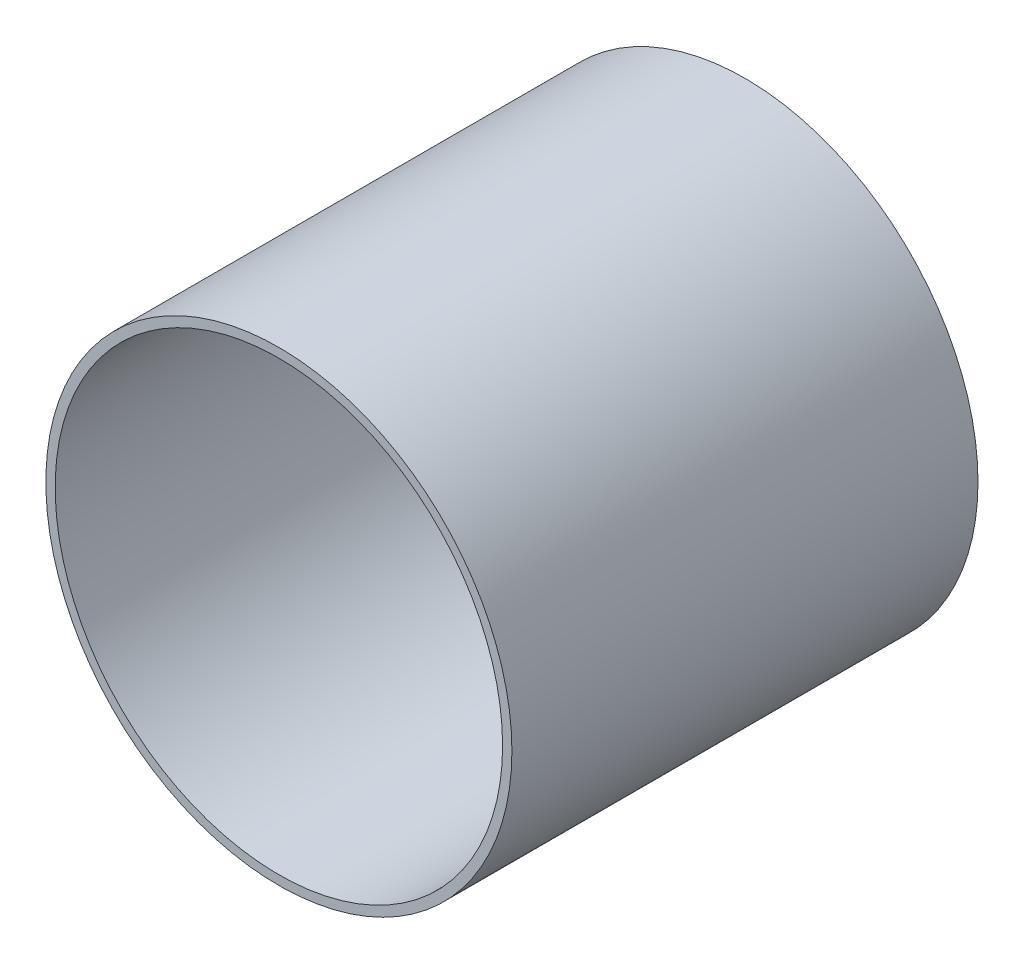
ISO-10303-21;
HEADER;
FILE_DESCRIPTION(('STEP AP214'),'2;1');
FILE_NAME('part.step','',(''),(''),'','','');
FILE_SCHEMA(('AUTOMOTIVE_DESIGN { 1 0 10303 214 1 1 1 1 }'));
ENDSEC;
DATA;
#1=APPLICATION_CONTEXT('core data for automotive mechanical design processes');
#2=APPLICATION_PROTOCOL_DEFINITION('international standard','automotive_design',2000,#1);
#3=PRODUCT_CONTEXT('',#1,'mechanical');
#4=PRODUCT('Part','Part','',(#3));
#5=PRODUCT_RELATED_PRODUCT_CATEGORY('part','',(#4));
#6=PRODUCT_DEFINITION_FORMATION('','',#4);
#7=PRODUCT_DEFINITION_CONTEXT('part definition',#1,'design');
#8=PRODUCT_DEFINITION('design','',#6,#7);
#9=PRODUCT_DEFINITION_SHAPE('','',#8);
#10=(LENGTH_UNIT() NAMED_UNIT(*) SI_UNIT(.MILLI.,.METRE.));
#11=(NAMED_UNIT(*) PLANE_ANGLE_UNIT() SI_UNIT($,.RADIAN.));
#12=(NAMED_UNIT(*) SI_UNIT($,.STERADIAN.) SOLID_ANGLE_UNIT());
#13=UNCERTAINTY_MEASURE_WITH_UNIT(LENGTH_MEASURE(1.E-05),#10,'distance_accuracy_value','');
#14=(GEOMETRIC_REPRESENTATION_CONTEXT(3) GLOBAL_UNCERTAINTY_ASSIGNED_CONTEXT((#13)) GLOBAL_UNIT_ASSIGNED_CONTEXT((#10,
#11,#12)) REPRESENTATION_CONTEXT('',''));
#15=CARTESIAN_POINT('',(0.,0.,0.));
#16=DIRECTION('',(0.,0.,1.));
#17=DIRECTION('',(1.,0.,0.));
#18=AXIS2_PLACEMENT_3D('',#15,#16,#17);
#19=CARTESIAN_POINT('',(0.,0.,100.));
#20=DIRECTION('',(0.,0.,1.));
#21=DIRECTION('',(1.,0.,0.));
#22=AXIS2_PLACEMENT_3D('',#19,#20,#21);
#23=PLANE('',#22);
#24=CARTESIAN_POINT('',(0.,0.,100.));
#25=DIRECTION('',(0.,0.,1.));
#26=DIRECTION('',(1.,0.,0.));
#27=AXIS2_PLACEMENT_3D('',#24,#25,#26);
#28=CIRCLE('',#27,50.);
#29=CARTESIAN_POINT('',(50.,0.,100.));
#30=VERTEX_POINT('',#29);
#31=EDGE_CURVE('E10',#30,#30,#28,.T.);
#32=ORIENTED_EDGE('',*,*,#31,.T.);
#33=EDGE_LOOP('',(#32));
#34=FACE_BOUND('',#33,.T.);
#35=CARTESIAN_POINT('',(0.,0.,100.));
#36=DIRECTION('',(0.,0.,1.));
#37=DIRECTION('',(1.,0.,0.));
#38=AXIS2_PLACEMENT_3D('',#35,#36,#37);
#39=CIRCLE('',#38,48.);
#40=CARTESIAN_POINT('',(48.,0.,100.));
#41=VERTEX_POINT('',#40);
#42=EDGE_CURVE('E45',#41,#41,#39,.T.);
#43=ORIENTED_EDGE('',*,*,#42,.F.);
#44=EDGE_LOOP('',(#43));
#45=FACE_BOUND('',#44,.T.);
#46=ADVANCED_FACE('F34',(#34,#45),#23,.T.);
#47=CARTESIAN_POINT('',(0.,0.,0.));
#48=DIRECTION('',(0.,0.,1.));
#49=DIRECTION('',(1.,0.,0.));
#50=AXIS2_PLACEMENT_3D('',#47,#48,#49);
#51=PLANE('',#50);
#52=CARTESIAN_POINT('',(0.,0.,0.));
#53=DIRECTION('',(0.,0.,1.));
#54=DIRECTION('',(1.,0.,0.));
#55=AXIS2_PLACEMENT_3D('',#52,#53,#54);
#56=CIRCLE('',#55,50.);
#57=CARTESIAN_POINT('',(50.,0.,0.));
#58=VERTEX_POINT('',#57);
#59=EDGE_CURVE('E38',#58,#58,#56,.T.);
#60=ORIENTED_EDGE('',*,*,#59,.F.);
#61=EDGE_LOOP('',(#60));
#62=FACE_BOUND('',#61,.T.);
#63=CARTESIAN_POINT('',(0.,0.,0.));
#64=DIRECTION('',(0.,0.,1.));
#65=DIRECTION('',(1.,0.,0.));
#66=AXIS2_PLACEMENT_3D('',#63,#64,#65);
#67=CIRCLE('',#66,48.);
#68=CARTESIAN_POINT('',(48.,0.,0.));
#69=VERTEX_POINT('',#68);
#70=EDGE_CURVE('E47',#69,#69,#67,.T.);
#71=ORIENTED_EDGE('',*,*,#70,.T.);
#72=EDGE_LOOP('',(#71));
#73=FACE_BOUND('',#72,.T.);
#74=ADVANCED_FACE('F57',(#62,#73),#51,.F.);
#75=CARTESIAN_POINT('',(0.,0.,100.));
#76=DIRECTION('',(0.,0.,-1.));
#77=DIRECTION('',(-1.,0.,0.));
#78=AXIS2_PLACEMENT_3D('',#75,#76,#77);
#79=CYLINDRICAL_SURFACE('',#78,50.);
#80=ORIENTED_EDGE('',*,*,#31,.F.);
#81=EDGE_LOOP('',(#80));
#82=FACE_BOUND('',#81,.T.);
#83=ORIENTED_EDGE('',*,*,#59,.T.);
#84=EDGE_LOOP('',(#83));
#85=FACE_BOUND('',#84,.T.);
#86=ADVANCED_FACE('F36',(#82,#85),#79,.T.);
#87=CARTESIAN_POINT('',(0.,0.,100.));
#88=DIRECTION('',(0.,0.,-1.));
#89=DIRECTION('',(-1.,0.,0.));
#90=AXIS2_PLACEMENT_3D('',#87,#88,#89);
#91=CYLINDRICAL_SURFACE('',#90,48.);
#92=ORIENTED_EDGE('',*,*,#42,.T.);
#93=EDGE_LOOP('',(#92));
#94=FACE_BOUND('',#93,.T.);
#95=ORIENTED_EDGE('',*,*,#70,.F.);
#96=EDGE_LOOP('',(#95));
#97=FACE_BOUND('',#96,.T.);
#98=ADVANCED_FACE('F53',(#94,#97),#91,.F.);
#99=CLOSED_SHELL('',(#46,#74,#86,#98));
#100=MANIFOLD_SOLID_BREP('B2',#99);
#101=ADVANCED_BREP_SHAPE_REPRESENTATION('',(#18,#100),#14);
#102=SHAPE_DEFINITION_REPRESENTATION(#9,#101);
ENDSEC;
END-ISO-10303-21;
